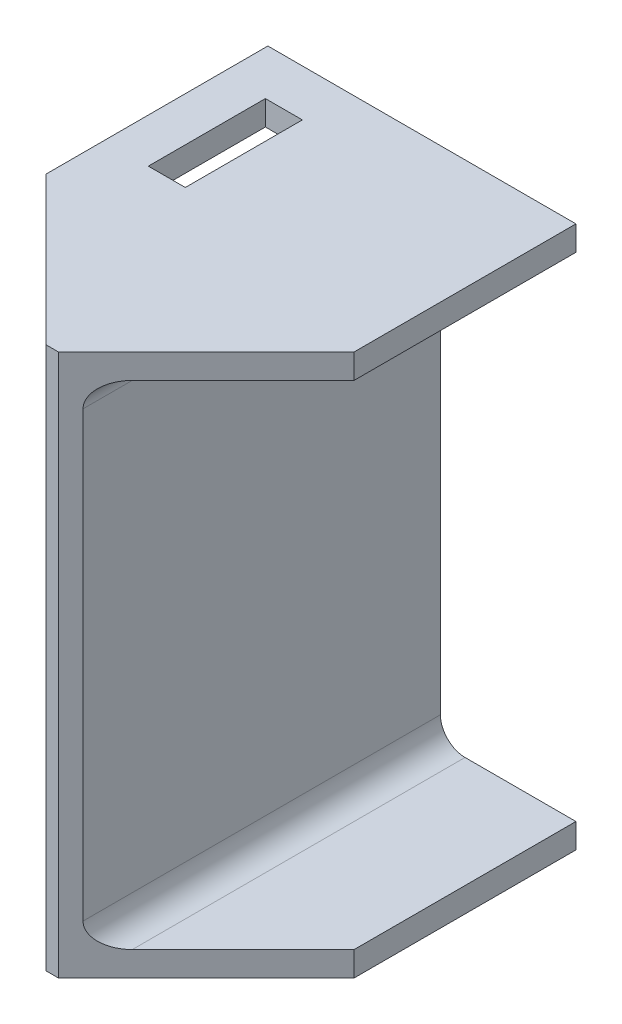
ISO-10303-21;
HEADER;
FILE_DESCRIPTION(('STEP AP214'),'2;1');
FILE_NAME('part.step','',(''),(''),'','','');
FILE_SCHEMA(('AUTOMOTIVE_DESIGN { 1 0 10303 214 1 1 1 1 }'));
ENDSEC;
DATA;
#1=APPLICATION_CONTEXT('core data for automotive mechanical design processes');
#2=APPLICATION_PROTOCOL_DEFINITION('international standard','automotive_design',2000,#1);
#3=PRODUCT_CONTEXT('',#1,'mechanical');
#4=PRODUCT('Part','Part','',(#3));
#5=PRODUCT_RELATED_PRODUCT_CATEGORY('part','',(#4));
#6=PRODUCT_DEFINITION_FORMATION('','',#4);
#7=PRODUCT_DEFINITION_CONTEXT('part definition',#1,'design');
#8=PRODUCT_DEFINITION('design','',#6,#7);
#9=PRODUCT_DEFINITION_SHAPE('','',#8);
#10=(LENGTH_UNIT() NAMED_UNIT(*) SI_UNIT(.MILLI.,.METRE.));
#11=(NAMED_UNIT(*) PLANE_ANGLE_UNIT() SI_UNIT($,.RADIAN.));
#12=(NAMED_UNIT(*) SI_UNIT($,.STERADIAN.) SOLID_ANGLE_UNIT());
#13=UNCERTAINTY_MEASURE_WITH_UNIT(LENGTH_MEASURE(1.E-05),#10,'distance_accuracy_value','');
#14=(GEOMETRIC_REPRESENTATION_CONTEXT(3) GLOBAL_UNCERTAINTY_ASSIGNED_CONTEXT((#13)) GLOBAL_UNIT_ASSIGNED_CONTEXT((#10,
#11,#12)) REPRESENTATION_CONTEXT('',''));
#15=CARTESIAN_POINT('',(0.,0.,0.));
#16=DIRECTION('',(0.,0.,1.));
#17=DIRECTION('',(1.,0.,0.));
#18=AXIS2_PLACEMENT_3D('',#15,#16,#17);
#19=CARTESIAN_POINT('',(-7.13864306784661,36.9262536873156,30.));
#20=DIRECTION('',(1.,0.,0.));
#21=DIRECTION('',(0.,0.,-1.));
#22=AXIS2_PLACEMENT_3D('',#19,#20,#21);
#23=PLANE('',#22);
#24=DIRECTION('',(0.,0.,-1.));
#25=VECTOR('',#24,1.);
#26=CARTESIAN_POINT('',(-7.13864306784661,34.9262536873156,30.));
#27=LINE('',#26,#25);
#28=CARTESIAN_POINT('',(-7.13864306784661,34.9262536873156,18.));
#29=VERTEX_POINT('',#28);
#30=CARTESIAN_POINT('',(-7.13864306784661,34.9262536873156,0.));
#31=VERTEX_POINT('',#30);
#32=EDGE_CURVE('E274',#29,#31,#27,.T.);
#33=ORIENTED_EDGE('',*,*,#32,.F.);
#34=DIRECTION('',(0.,1.,0.));
#35=VECTOR('',#34,1.);
#36=CARTESIAN_POINT('',(-7.13864306784661,36.9262536873156,18.));
#37=LINE('',#36,#35);
#38=CARTESIAN_POINT('',(-7.13864306784661,36.9262536873156,18.));
#39=VERTEX_POINT('',#38);
#40=EDGE_CURVE('E296',#29,#39,#37,.T.);
#41=ORIENTED_EDGE('',*,*,#40,.T.);
#42=DIRECTION('',(0.,0.,-1.));
#43=VECTOR('',#42,1.);
#44=CARTESIAN_POINT('',(-7.13864306784661,36.9262536873156,30.));
#45=LINE('',#44,#43);
#46=CARTESIAN_POINT('',(-7.13864306784661,36.9262536873156,0.));
#47=VERTEX_POINT('',#46);
#48=EDGE_CURVE('E226',#39,#47,#45,.T.);
#49=ORIENTED_EDGE('',*,*,#48,.T.);
#50=DIRECTION('',(0.,-1.,0.));
#51=VECTOR('',#50,1.);
#52=CARTESIAN_POINT('',(-7.13864306784661,36.9262536873156,0.));
#53=LINE('',#52,#51);
#54=EDGE_CURVE('E218',#47,#31,#53,.T.);
#55=ORIENTED_EDGE('',*,*,#54,.T.);
#56=EDGE_LOOP('',(#33,#41,#49,#55));
#57=FACE_BOUND('',#56,.T.);
#58=ADVANCED_FACE('F33',(#57),#23,.F.);
#59=CARTESIAN_POINT('',(-7.13864306784661,34.9262536873156,30.));
#60=DIRECTION('',(0.,1.,0.));
#61=DIRECTION('',(0.,0.,1.));
#62=AXIS2_PLACEMENT_3D('',#59,#60,#61);
#63=PLANE('',#62);
#64=DIRECTION('',(1.,0.,0.));
#65=VECTOR('',#64,1.);
#66=CARTESIAN_POINT('',(-7.13864306784661,34.9262536873156,13.2945058523077));
#67=LINE('',#66,#65);
#68=CARTESIAN_POINT('',(-3.54545344224277,34.9262536873156,13.2945058523077));
#69=VERTEX_POINT('',#68);
#70=CARTESIAN_POINT('',(-0.545453442242774,34.9262536873156,13.2945058523077));
#71=VERTEX_POINT('',#70);
#72=EDGE_CURVE('E212',#69,#71,#67,.T.);
#73=ORIENTED_EDGE('',*,*,#72,.T.);
#74=DIRECTION('',(0.,0.,-1.));
#75=VECTOR('',#74,1.);
#76=CARTESIAN_POINT('',(-0.545453442242774,34.9262536873156,30.));
#77=LINE('',#76,#75);
#78=CARTESIAN_POINT('',(-0.545453442242774,34.9262536873156,3.79450585230774));
#79=VERTEX_POINT('',#78);
#80=EDGE_CURVE('E215',#71,#79,#77,.T.);
#81=ORIENTED_EDGE('',*,*,#80,.T.);
#82=DIRECTION('',(-1.,0.,0.));
#83=VECTOR('',#82,1.);
#84=CARTESIAN_POINT('',(-7.13864306784661,34.9262536873156,3.79450585230774));
#85=LINE('',#84,#83);
#86=CARTESIAN_POINT('',(-3.54545344224277,34.9262536873156,3.79450585230773));
#87=VERTEX_POINT('',#86);
#88=EDGE_CURVE('E207',#79,#87,#85,.T.);
#89=ORIENTED_EDGE('',*,*,#88,.T.);
#90=DIRECTION('',(0.,0.,1.));
#91=VECTOR('',#90,1.);
#92=CARTESIAN_POINT('',(-3.54545344224277,34.9262536873156,30.));
#93=LINE('',#92,#91);
#94=EDGE_CURVE('E187',#87,#69,#93,.T.);
#95=ORIENTED_EDGE('',*,*,#94,.T.);
#96=EDGE_LOOP('',(#73,#81,#89,#95));
#97=FACE_BOUND('',#96,.T.);
#98=DIRECTION('',(1.,0.,0.));
#99=VECTOR('',#98,1.);
#100=CARTESIAN_POINT('',(-7.13864306784661,34.9262536873156,0.));
#101=LINE('',#100,#99);
#102=CARTESIAN_POINT('',(1.86135693215339,34.9262536873156,0.));
#103=VERTEX_POINT('',#102);
#104=EDGE_CURVE('E229',#31,#103,#101,.T.);
#105=ORIENTED_EDGE('',*,*,#104,.T.);
#106=DIRECTION('',(0.,0.,-1.));
#107=VECTOR('',#106,1.);
#108=CARTESIAN_POINT('',(1.86135693215339,34.9262536873156,29.));
#109=LINE('',#108,#107);
#110=CARTESIAN_POINT('',(1.86135693215339,34.9262536873156,27.));
#111=VERTEX_POINT('',#110);
#112=EDGE_CURVE('E327',#103,#111,#109,.F.);
#113=ORIENTED_EDGE('',*,*,#112,.T.);
#114=DIRECTION('',(-0.707106781186546,0.,-0.707106781186549));
#115=VECTOR('',#114,1.);
#116=CARTESIAN_POINT('',(4.86135693215339,34.9262536873156,30.));
#117=LINE('',#116,#115);
#118=EDGE_CURVE('E294',#111,#29,#117,.T.);
#119=ORIENTED_EDGE('',*,*,#118,.T.);
#120=ORIENTED_EDGE('',*,*,#32,.T.);
#121=EDGE_LOOP('',(#105,#113,#119,#120));
#122=FACE_BOUND('',#121,.T.);
#123=ADVANCED_FACE('F426',(#97,#122),#63,.F.);
#124=CARTESIAN_POINT('',(3.86135693215339,34.9262536873156,30.));
#125=DIRECTION('',(1.,0.,0.));
#126=DIRECTION('',(0.,1.,0.));
#127=AXIS2_PLACEMENT_3D('',#124,#125,#126);
#128=PLANE('',#127);
#129=DIRECTION('',(0.,1.,0.));
#130=VECTOR('',#129,1.);
#131=CARTESIAN_POINT('',(3.86135693215339,0.,29.));
#132=LINE('',#131,#130);
#133=CARTESIAN_POINT('',(3.86135693215339,-3.07374631268437,29.));
#134=VERTEX_POINT('',#133);
#135=CARTESIAN_POINT('',(3.86135693215339,32.9262536873156,29.));
#136=VERTEX_POINT('',#135);
#137=EDGE_CURVE('E291',#134,#136,#132,.T.);
#138=ORIENTED_EDGE('',*,*,#137,.T.);
#139=DIRECTION('',(0.,0.,-1.));
#140=VECTOR('',#139,1.);
#141=CARTESIAN_POINT('',(3.86135693215339,32.9262536873156,0.));
#142=LINE('',#141,#140);
#143=CARTESIAN_POINT('',(3.86135693215339,32.9262536873156,0.));
#144=VERTEX_POINT('',#143);
#145=EDGE_CURVE('E324',#136,#144,#142,.T.);
#146=ORIENTED_EDGE('',*,*,#145,.T.);
#147=DIRECTION('',(0.,-1.,0.));
#148=VECTOR('',#147,1.);
#149=CARTESIAN_POINT('',(3.86135693215339,34.9262536873156,0.));
#150=LINE('',#149,#148);
#151=CARTESIAN_POINT('',(3.86135693215339,-3.07374631268437,0.));
#152=VERTEX_POINT('',#151);
#153=EDGE_CURVE('E232',#144,#152,#150,.T.);
#154=ORIENTED_EDGE('',*,*,#153,.T.);
#155=DIRECTION('',(0.,0.,-1.));
#156=VECTOR('',#155,1.);
#157=CARTESIAN_POINT('',(3.86135693215339,-3.07374631268437,29.));
#158=LINE('',#157,#156);
#159=EDGE_CURVE('E322',#152,#134,#158,.F.);
#160=ORIENTED_EDGE('',*,*,#159,.T.);
#161=EDGE_LOOP('',(#138,#146,#154,#160));
#162=FACE_BOUND('',#161,.T.);
#163=ADVANCED_FACE('F419',(#162),#128,.F.);
#164=CARTESIAN_POINT('',(-7.13864306784661,-5.07374631268437,30.));
#165=DIRECTION('',(0.,-1.,0.));
#166=DIRECTION('',(1.,0.,0.));
#167=AXIS2_PLACEMENT_3D('',#164,#165,#166);
#168=PLANE('',#167);
#169=DIRECTION('',(0.707106781186546,0.,0.707106781186549));
#170=VECTOR('',#169,1.);
#171=CARTESIAN_POINT('',(4.86135693215339,-5.07374631268437,30.));
#172=LINE('',#171,#170);
#173=CARTESIAN_POINT('',(-7.13864306784661,-5.07374631268437,18.));
#174=VERTEX_POINT('',#173);
#175=CARTESIAN_POINT('',(1.86135693215339,-5.07374631268437,27.));
#176=VERTEX_POINT('',#175);
#177=EDGE_CURVE('E288',#174,#176,#172,.T.);
#178=ORIENTED_EDGE('',*,*,#177,.T.);
#179=DIRECTION('',(0.,0.,-1.));
#180=VECTOR('',#179,1.);
#181=CARTESIAN_POINT('',(1.86135693215339,-5.07374631268437,0.));
#182=LINE('',#181,#180);
#183=CARTESIAN_POINT('',(1.86135693215339,-5.07374631268437,0.));
#184=VERTEX_POINT('',#183);
#185=EDGE_CURVE('E329',#176,#184,#182,.T.);
#186=ORIENTED_EDGE('',*,*,#185,.T.);
#187=DIRECTION('',(-1.,0.,0.));
#188=VECTOR('',#187,1.);
#189=CARTESIAN_POINT('',(-7.13864306784661,-5.07374631268437,0.));
#190=LINE('',#189,#188);
#191=CARTESIAN_POINT('',(-7.13864306784661,-5.07374631268437,0.));
#192=VERTEX_POINT('',#191);
#193=EDGE_CURVE('E235',#184,#192,#190,.T.);
#194=ORIENTED_EDGE('',*,*,#193,.T.);
#195=DIRECTION('',(0.,0.,-1.));
#196=VECTOR('',#195,1.);
#197=CARTESIAN_POINT('',(-7.13864306784661,-5.07374631268437,30.));
#198=LINE('',#197,#196);
#199=EDGE_CURVE('E271',#174,#192,#198,.T.);
#200=ORIENTED_EDGE('',*,*,#199,.F.);
#201=EDGE_LOOP('',(#178,#186,#194,#200));
#202=FACE_BOUND('',#201,.T.);
#203=ADVANCED_FACE('F410',(#202),#168,.F.);
#204=CARTESIAN_POINT('',(-7.13864306784661,-5.07374631268437,30.));
#205=DIRECTION('',(1.,0.,0.));
#206=DIRECTION('',(0.,1.,0.));
#207=AXIS2_PLACEMENT_3D('',#204,#205,#206);
#208=PLANE('',#207);
#209=DIRECTION('',(0.,0.,-1.));
#210=VECTOR('',#209,1.);
#211=CARTESIAN_POINT('',(-7.13864306784661,-7.07374631268437,30.));
#212=LINE('',#211,#210);
#213=CARTESIAN_POINT('',(-7.13864306784661,-7.07374631268437,18.));
#214=VERTEX_POINT('',#213);
#215=CARTESIAN_POINT('',(-7.13864306784661,-7.07374631268437,0.));
#216=VERTEX_POINT('',#215);
#217=EDGE_CURVE('E269',#214,#216,#212,.T.);
#218=ORIENTED_EDGE('',*,*,#217,.F.);
#219=DIRECTION('',(0.,1.,0.));
#220=VECTOR('',#219,1.);
#221=CARTESIAN_POINT('',(-7.13864306784661,0.,18.));
#222=LINE('',#221,#220);
#223=EDGE_CURVE('E286',#214,#174,#222,.T.);
#224=ORIENTED_EDGE('',*,*,#223,.T.);
#225=ORIENTED_EDGE('',*,*,#199,.T.);
#226=DIRECTION('',(0.,-1.,0.));
#227=VECTOR('',#226,1.);
#228=CARTESIAN_POINT('',(-7.13864306784661,-5.07374631268437,0.));
#229=LINE('',#228,#227);
#230=EDGE_CURVE('E237',#192,#216,#229,.T.);
#231=ORIENTED_EDGE('',*,*,#230,.T.);
#232=EDGE_LOOP('',(#218,#224,#225,#231));
#233=FACE_BOUND('',#232,.T.);
#234=ADVANCED_FACE('F406',(#233),#208,.F.);
#235=CARTESIAN_POINT('',(-7.13864306784661,-7.07374631268437,30.));
#236=DIRECTION('',(0.,1.,0.));
#237=DIRECTION('',(-1.,0.,0.));
#238=AXIS2_PLACEMENT_3D('',#235,#236,#237);
#239=PLANE('',#238);
#240=DIRECTION('',(1.,0.,0.));
#241=VECTOR('',#240,1.);
#242=CARTESIAN_POINT('',(-7.13864306784661,-7.07374631268437,30.));
#243=LINE('',#242,#241);
#244=CARTESIAN_POINT('',(4.86135693215339,-7.07374631268437,30.));
#245=VERTEX_POINT('',#244);
#246=CARTESIAN_POINT('',(5.86135693215339,-7.07374631268437,30.));
#247=VERTEX_POINT('',#246);
#248=EDGE_CURVE('E219',#245,#247,#243,.T.);
#249=ORIENTED_EDGE('',*,*,#248,.F.);
#250=DIRECTION('',(-0.707106781186546,0.,-0.707106781186549));
#251=VECTOR('',#250,1.);
#252=CARTESIAN_POINT('',(4.86135693215339,-7.07374631268437,30.));
#253=LINE('',#252,#251);
#254=EDGE_CURVE('E284',#245,#214,#253,.T.);
#255=ORIENTED_EDGE('',*,*,#254,.T.);
#256=ORIENTED_EDGE('',*,*,#217,.T.);
#257=DIRECTION('',(1.,0.,0.));
#258=VECTOR('',#257,1.);
#259=CARTESIAN_POINT('',(-7.13864306784661,-7.07374631268437,0.));
#260=LINE('',#259,#258);
#261=CARTESIAN_POINT('',(17.8613569321534,-7.07374631268437,0.));
#262=VERTEX_POINT('',#261);
#263=EDGE_CURVE('E240',#216,#262,#260,.T.);
#264=ORIENTED_EDGE('',*,*,#263,.T.);
#265=DIRECTION('',(0.,0.,-1.));
#266=VECTOR('',#265,1.);
#267=CARTESIAN_POINT('',(17.8613569321534,-7.07374631268437,30.));
#268=LINE('',#267,#266);
#269=CARTESIAN_POINT('',(17.8613569321534,-7.07374631268437,18.));
#270=VERTEX_POINT('',#269);
#271=EDGE_CURVE('E267',#270,#262,#268,.T.);
#272=ORIENTED_EDGE('',*,*,#271,.F.);
#273=DIRECTION('',(-0.707106781186546,0.,0.707106781186549));
#274=VECTOR('',#273,1.);
#275=CARTESIAN_POINT('',(5.86135693215339,-7.07374631268437,30.));
#276=LINE('',#275,#274);
#277=EDGE_CURVE('E282',#270,#247,#276,.T.);
#278=ORIENTED_EDGE('',*,*,#277,.T.);
#279=EDGE_LOOP('',(#249,#255,#256,#264,#272,#278));
#280=FACE_BOUND('',#279,.T.);
#281=ADVANCED_FACE('F397',(#280),#239,.F.);
#282=CARTESIAN_POINT('',(17.8613569321534,-5.07374631268437,30.));
#283=DIRECTION('',(-1.,0.,0.));
#284=DIRECTION('',(0.,0.,1.));
#285=AXIS2_PLACEMENT_3D('',#282,#283,#284);
#286=PLANE('',#285);
#287=DIRECTION('',(0.,0.,-1.));
#288=VECTOR('',#287,1.);
#289=CARTESIAN_POINT('',(17.8613569321534,-5.07374631268437,30.));
#290=LINE('',#289,#288);
#291=CARTESIAN_POINT('',(17.8613569321534,-5.07374631268437,18.));
#292=VERTEX_POINT('',#291);
#293=CARTESIAN_POINT('',(17.8613569321534,-5.07374631268437,0.));
#294=VERTEX_POINT('',#293);
#295=EDGE_CURVE('E265',#292,#294,#290,.T.);
#296=ORIENTED_EDGE('',*,*,#295,.F.);
#297=DIRECTION('',(0.,-1.,0.));
#298=VECTOR('',#297,1.);
#299=CARTESIAN_POINT('',(17.8613569321534,0.,18.));
#300=LINE('',#299,#298);
#301=EDGE_CURVE('E312',#292,#270,#300,.T.);
#302=ORIENTED_EDGE('',*,*,#301,.T.);
#303=ORIENTED_EDGE('',*,*,#271,.T.);
#304=DIRECTION('',(0.,1.,0.));
#305=VECTOR('',#304,1.);
#306=CARTESIAN_POINT('',(17.8613569321534,-5.07374631268437,0.));
#307=LINE('',#306,#305);
#308=EDGE_CURVE('E243',#262,#294,#307,.T.);
#309=ORIENTED_EDGE('',*,*,#308,.T.);
#310=EDGE_LOOP('',(#296,#302,#303,#309));
#311=FACE_BOUND('',#310,.T.);
#312=ADVANCED_FACE('F401',(#311),#286,.F.);
#313=CARTESIAN_POINT('',(6.86135693215339,-5.07374631268437,30.));
#314=DIRECTION('',(0.,-1.,0.));
#315=DIRECTION('',(0.,0.,-1.));
#316=AXIS2_PLACEMENT_3D('',#313,#314,#315);
#317=PLANE('',#316);
#318=DIRECTION('',(-1.,0.,0.));
#319=VECTOR('',#318,1.);
#320=CARTESIAN_POINT('',(6.86135693215339,-5.07374631268437,0.));
#321=LINE('',#320,#319);
#322=CARTESIAN_POINT('',(8.86135693215339,-5.07374631268437,0.));
#323=VERTEX_POINT('',#322);
#324=EDGE_CURVE('E246',#294,#323,#321,.T.);
#325=ORIENTED_EDGE('',*,*,#324,.T.);
#326=DIRECTION('',(0.,0.,-1.));
#327=VECTOR('',#326,1.);
#328=CARTESIAN_POINT('',(8.86135693215339,-5.07374631268437,29.));
#329=LINE('',#328,#327);
#330=CARTESIAN_POINT('',(8.86135693215339,-5.07374631268437,27.));
#331=VERTEX_POINT('',#330);
#332=EDGE_CURVE('E332',#323,#331,#329,.F.);
#333=ORIENTED_EDGE('',*,*,#332,.T.);
#334=DIRECTION('',(0.707106781186546,0.,-0.707106781186549));
#335=VECTOR('',#334,1.);
#336=CARTESIAN_POINT('',(5.86135693215339,-5.07374631268437,30.));
#337=LINE('',#336,#335);
#338=EDGE_CURVE('E310',#331,#292,#337,.T.);
#339=ORIENTED_EDGE('',*,*,#338,.T.);
#340=ORIENTED_EDGE('',*,*,#295,.T.);
#341=EDGE_LOOP('',(#325,#333,#339,#340));
#342=FACE_BOUND('',#341,.T.);
#343=ADVANCED_FACE('F355',(#342),#317,.F.);
#344=CARTESIAN_POINT('',(6.86135693215339,34.9262536873156,30.));
#345=DIRECTION('',(-1.,0.,0.));
#346=DIRECTION('',(0.,0.,1.));
#347=AXIS2_PLACEMENT_3D('',#344,#345,#346);
#348=PLANE('',#347);
#349=DIRECTION('',(0.,1.,0.));
#350=VECTOR('',#349,1.);
#351=CARTESIAN_POINT('',(6.86135693215339,34.9262536873156,0.));
#352=LINE('',#351,#350);
#353=CARTESIAN_POINT('',(6.86135693215339,-3.07374631268437,0.));
#354=VERTEX_POINT('',#353);
#355=CARTESIAN_POINT('',(6.86135693215339,32.9262536873156,0.));
#356=VERTEX_POINT('',#355);
#357=EDGE_CURVE('E249',#354,#356,#352,.T.);
#358=ORIENTED_EDGE('',*,*,#357,.T.);
#359=DIRECTION('',(0.,0.,-1.));
#360=VECTOR('',#359,1.);
#361=CARTESIAN_POINT('',(6.86135693215339,32.9262536873156,29.));
#362=LINE('',#361,#360);
#363=CARTESIAN_POINT('',(6.86135693215339,32.9262536873156,29.));
#364=VERTEX_POINT('',#363);
#365=EDGE_CURVE('E320',#356,#364,#362,.F.);
#366=ORIENTED_EDGE('',*,*,#365,.T.);
#367=DIRECTION('',(0.,-1.,0.));
#368=VECTOR('',#367,1.);
#369=CARTESIAN_POINT('',(6.86135693215339,0.,29.));
#370=LINE('',#369,#368);
#371=CARTESIAN_POINT('',(6.86135693215339,-3.07374631268437,29.));
#372=VERTEX_POINT('',#371);
#373=EDGE_CURVE('E307',#364,#372,#370,.T.);
#374=ORIENTED_EDGE('',*,*,#373,.T.);
#375=DIRECTION('',(0.,0.,-1.));
#376=VECTOR('',#375,1.);
#377=CARTESIAN_POINT('',(6.86135693215339,-3.07374631268437,0.));
#378=LINE('',#377,#376);
#379=EDGE_CURVE('E317',#372,#354,#378,.T.);
#380=ORIENTED_EDGE('',*,*,#379,.T.);
#381=EDGE_LOOP('',(#358,#366,#374,#380));
#382=FACE_BOUND('',#381,.T.);
#383=ADVANCED_FACE('F366',(#382),#348,.F.);
#384=CARTESIAN_POINT('',(6.86135693215339,34.9262536873156,30.));
#385=DIRECTION('',(0.,1.,0.));
#386=DIRECTION('',(-1.,0.,0.));
#387=AXIS2_PLACEMENT_3D('',#384,#385,#386);
#388=PLANE('',#387);
#389=DIRECTION('',(-0.707106781186546,0.,0.707106781186549));
#390=VECTOR('',#389,1.);
#391=CARTESIAN_POINT('',(5.86135693215341,34.9262536873156,30.));
#392=LINE('',#391,#390);
#393=CARTESIAN_POINT('',(17.8613569321534,34.9262536873156,18.));
#394=VERTEX_POINT('',#393);
#395=CARTESIAN_POINT('',(8.8613569321534,34.9262536873156,27.));
#396=VERTEX_POINT('',#395);
#397=EDGE_CURVE('E304',#394,#396,#392,.T.);
#398=ORIENTED_EDGE('',*,*,#397,.T.);
#399=DIRECTION('',(0.,0.,-1.));
#400=VECTOR('',#399,1.);
#401=CARTESIAN_POINT('',(8.86135693215339,34.9262536873156,0.));
#402=LINE('',#401,#400);
#403=CARTESIAN_POINT('',(8.86135693215339,34.9262536873156,0.));
#404=VERTEX_POINT('',#403);
#405=EDGE_CURVE('E314',#396,#404,#402,.T.);
#406=ORIENTED_EDGE('',*,*,#405,.T.);
#407=DIRECTION('',(1.,0.,0.));
#408=VECTOR('',#407,1.);
#409=CARTESIAN_POINT('',(6.86135693215339,34.9262536873156,0.));
#410=LINE('',#409,#408);
#411=CARTESIAN_POINT('',(17.8613569321534,34.9262536873156,0.));
#412=VERTEX_POINT('',#411);
#413=EDGE_CURVE('E252',#404,#412,#410,.T.);
#414=ORIENTED_EDGE('',*,*,#413,.T.);
#415=DIRECTION('',(0.,0.,-1.));
#416=VECTOR('',#415,1.);
#417=CARTESIAN_POINT('',(17.8613569321534,34.9262536873156,30.));
#418=LINE('',#417,#416);
#419=EDGE_CURVE('E262',#394,#412,#418,.T.);
#420=ORIENTED_EDGE('',*,*,#419,.F.);
#421=EDGE_LOOP('',(#398,#406,#414,#420));
#422=FACE_BOUND('',#421,.T.);
#423=ADVANCED_FACE('F374',(#422),#388,.F.);
#424=CARTESIAN_POINT('',(17.8613569321534,36.9262536873156,30.));
#425=DIRECTION('',(-1.,0.,0.));
#426=DIRECTION('',(0.,0.,1.));
#427=AXIS2_PLACEMENT_3D('',#424,#425,#426);
#428=PLANE('',#427);
#429=DIRECTION('',(0.,0.,-1.));
#430=VECTOR('',#429,1.);
#431=CARTESIAN_POINT('',(17.8613569321534,36.9262536873156,30.));
#432=LINE('',#431,#430);
#433=CARTESIAN_POINT('',(17.8613569321534,36.9262536873156,18.));
#434=VERTEX_POINT('',#433);
#435=CARTESIAN_POINT('',(17.8613569321534,36.9262536873156,0.));
#436=VERTEX_POINT('',#435);
#437=EDGE_CURVE('E260',#434,#436,#432,.T.);
#438=ORIENTED_EDGE('',*,*,#437,.F.);
#439=DIRECTION('',(0.,-1.,0.));
#440=VECTOR('',#439,1.);
#441=CARTESIAN_POINT('',(17.8613569321534,34.9262536873156,18.));
#442=LINE('',#441,#440);
#443=EDGE_CURVE('E302',#434,#394,#442,.T.);
#444=ORIENTED_EDGE('',*,*,#443,.T.);
#445=ORIENTED_EDGE('',*,*,#419,.T.);
#446=DIRECTION('',(0.,1.,0.));
#447=VECTOR('',#446,1.);
#448=CARTESIAN_POINT('',(17.8613569321534,36.9262536873156,0.));
#449=LINE('',#448,#447);
#450=EDGE_CURVE('E254',#412,#436,#449,.T.);
#451=ORIENTED_EDGE('',*,*,#450,.T.);
#452=EDGE_LOOP('',(#438,#444,#445,#451));
#453=FACE_BOUND('',#452,.T.);
#454=ADVANCED_FACE('F379',(#453),#428,.F.);
#455=CARTESIAN_POINT('',(-7.13864306784661,36.9262536873156,30.));
#456=DIRECTION('',(0.,-1.,0.));
#457=DIRECTION('',(0.,0.,-1.));
#458=AXIS2_PLACEMENT_3D('',#455,#456,#457);
#459=PLANE('',#458);
#460=DIRECTION('',(-1.,0.,0.));
#461=VECTOR('',#460,1.);
#462=CARTESIAN_POINT('',(-0.545453442242774,36.9262536873156,3.79450585230774));
#463=LINE('',#462,#461);
#464=CARTESIAN_POINT('',(-0.545453442242774,36.9262536873156,3.79450585230773));
#465=VERTEX_POINT('',#464);
#466=CARTESIAN_POINT('',(-3.54545344224277,36.9262536873156,3.79450585230774));
#467=VERTEX_POINT('',#466);
#468=EDGE_CURVE('E193',#465,#467,#463,.T.);
#469=ORIENTED_EDGE('',*,*,#468,.F.);
#470=DIRECTION('',(0.,0.,-1.));
#471=VECTOR('',#470,1.);
#472=CARTESIAN_POINT('',(-0.545453442242774,36.9262536873156,13.2945058523077));
#473=LINE('',#472,#471);
#474=CARTESIAN_POINT('',(-0.545453442242774,36.9262536873156,13.2945058523077));
#475=VERTEX_POINT('',#474);
#476=EDGE_CURVE('E56',#475,#465,#473,.T.);
#477=ORIENTED_EDGE('',*,*,#476,.F.);
#478=DIRECTION('',(1.,0.,0.));
#479=VECTOR('',#478,1.);
#480=CARTESIAN_POINT('',(-0.545453442242774,36.9262536873156,13.2945058523077));
#481=LINE('',#480,#479);
#482=CARTESIAN_POINT('',(-3.54545344224277,36.9262536873156,13.2945058523077));
#483=VERTEX_POINT('',#482);
#484=EDGE_CURVE('E200',#483,#475,#481,.T.);
#485=ORIENTED_EDGE('',*,*,#484,.F.);
#486=DIRECTION('',(0.,0.,1.));
#487=VECTOR('',#486,1.);
#488=CARTESIAN_POINT('',(-3.54545344224277,36.9262536873156,13.2945058523077));
#489=LINE('',#488,#487);
#490=EDGE_CURVE('E184',#467,#483,#489,.T.);
#491=ORIENTED_EDGE('',*,*,#490,.F.);
#492=EDGE_LOOP('',(#469,#477,#485,#491));
#493=FACE_BOUND('',#492,.T.);
#494=ORIENTED_EDGE('',*,*,#48,.F.);
#495=DIRECTION('',(0.707106781186546,0.,0.707106781186549));
#496=VECTOR('',#495,1.);
#497=CARTESIAN_POINT('',(4.86135693215339,36.9262536873156,30.));
#498=LINE('',#497,#496);
#499=CARTESIAN_POINT('',(4.86135693215339,36.9262536873156,30.));
#500=VERTEX_POINT('',#499);
#501=EDGE_CURVE('E300',#39,#500,#498,.T.);
#502=ORIENTED_EDGE('',*,*,#501,.T.);
#503=DIRECTION('',(-1.,0.,0.));
#504=VECTOR('',#503,1.);
#505=CARTESIAN_POINT('',(-7.13864306784661,36.9262536873156,30.));
#506=LINE('',#505,#504);
#507=CARTESIAN_POINT('',(5.86135693215339,36.9262536873156,30.));
#508=VERTEX_POINT('',#507);
#509=EDGE_CURVE('E222',#508,#500,#506,.T.);
#510=ORIENTED_EDGE('',*,*,#509,.F.);
#511=DIRECTION('',(0.707106781186546,0.,-0.707106781186549));
#512=VECTOR('',#511,1.);
#513=CARTESIAN_POINT('',(5.86135693215339,36.9262536873156,30.));
#514=LINE('',#513,#512);
#515=EDGE_CURVE('E298',#508,#434,#514,.T.);
#516=ORIENTED_EDGE('',*,*,#515,.T.);
#517=ORIENTED_EDGE('',*,*,#437,.T.);
#518=DIRECTION('',(-1.,0.,0.));
#519=VECTOR('',#518,1.);
#520=CARTESIAN_POINT('',(-7.13864306784661,36.9262536873156,0.));
#521=LINE('',#520,#519);
#522=EDGE_CURVE('E223',#436,#47,#521,.T.);
#523=ORIENTED_EDGE('',*,*,#522,.T.);
#524=EDGE_LOOP('',(#494,#502,#510,#516,#517,#523));
#525=FACE_BOUND('',#524,.T.);
#526=ADVANCED_FACE('F197',(#493,#525),#459,.F.);
#527=CARTESIAN_POINT('',(0.,0.,30.));
#528=DIRECTION('',(0.,0.,1.));
#529=DIRECTION('',(1.,0.,0.));
#530=AXIS2_PLACEMENT_3D('',#527,#528,#529);
#531=PLANE('',#530);
#532=ORIENTED_EDGE('',*,*,#509,.T.);
#533=DIRECTION('',(0.,-1.,0.));
#534=VECTOR('',#533,1.);
#535=CARTESIAN_POINT('',(4.86135693215339,34.9262536873156,30.));
#536=LINE('',#535,#534);
#537=EDGE_CURVE('E279',#500,#245,#536,.T.);
#538=ORIENTED_EDGE('',*,*,#537,.T.);
#539=ORIENTED_EDGE('',*,*,#248,.T.);
#540=DIRECTION('',(0.,1.,0.));
#541=VECTOR('',#540,1.);
#542=CARTESIAN_POINT('',(5.86135693215339,36.9262536873156,30.));
#543=LINE('',#542,#541);
#544=EDGE_CURVE('E276',#247,#508,#543,.T.);
#545=ORIENTED_EDGE('',*,*,#544,.T.);
#546=EDGE_LOOP('',(#532,#538,#539,#545));
#547=FACE_BOUND('',#546,.T.);
#548=ADVANCED_FACE('F388',(#547),#531,.T.);
#549=CARTESIAN_POINT('',(0.,0.,0.));
#550=DIRECTION('',(0.,0.,1.));
#551=DIRECTION('',(1.,0.,0.));
#552=AXIS2_PLACEMENT_3D('',#549,#550,#551);
#553=PLANE('',#552);
#554=ORIENTED_EDGE('',*,*,#54,.F.);
#555=ORIENTED_EDGE('',*,*,#522,.F.);
#556=ORIENTED_EDGE('',*,*,#450,.F.);
#557=ORIENTED_EDGE('',*,*,#413,.F.);
#558=CARTESIAN_POINT('',(8.86135693215339,32.9262536873156,0.));
#559=DIRECTION('',(0.,0.,1.));
#560=DIRECTION('',(1.,0.,0.));
#561=AXIS2_PLACEMENT_3D('',#558,#559,#560);
#562=CIRCLE('',#561,2.);
#563=EDGE_CURVE('E334',#404,#356,#562,.T.);
#564=ORIENTED_EDGE('',*,*,#563,.T.);
#565=ORIENTED_EDGE('',*,*,#357,.F.);
#566=CARTESIAN_POINT('',(8.86135693215339,-3.07374631268437,0.));
#567=DIRECTION('',(0.,0.,1.));
#568=DIRECTION('',(1.,0.,0.));
#569=AXIS2_PLACEMENT_3D('',#566,#567,#568);
#570=CIRCLE('',#569,2.);
#571=EDGE_CURVE('E41',#354,#323,#570,.T.);
#572=ORIENTED_EDGE('',*,*,#571,.T.);
#573=ORIENTED_EDGE('',*,*,#324,.F.);
#574=ORIENTED_EDGE('',*,*,#308,.F.);
#575=ORIENTED_EDGE('',*,*,#263,.F.);
#576=ORIENTED_EDGE('',*,*,#230,.F.);
#577=ORIENTED_EDGE('',*,*,#193,.F.);
#578=CARTESIAN_POINT('',(1.86135693215339,-3.07374631268437,0.));
#579=DIRECTION('',(0.,0.,1.));
#580=DIRECTION('',(1.,0.,0.));
#581=AXIS2_PLACEMENT_3D('',#578,#579,#580);
#582=CIRCLE('',#581,2.);
#583=EDGE_CURVE('E342',#184,#152,#582,.T.);
#584=ORIENTED_EDGE('',*,*,#583,.T.);
#585=ORIENTED_EDGE('',*,*,#153,.F.);
#586=CARTESIAN_POINT('',(1.86135693215339,32.9262536873156,0.));
#587=DIRECTION('',(0.,0.,1.));
#588=DIRECTION('',(1.,0.,0.));
#589=AXIS2_PLACEMENT_3D('',#586,#587,#588);
#590=CIRCLE('',#589,2.);
#591=EDGE_CURVE('E338',#144,#103,#590,.T.);
#592=ORIENTED_EDGE('',*,*,#591,.T.);
#593=ORIENTED_EDGE('',*,*,#104,.F.);
#594=EDGE_LOOP('',(#554,#555,#556,#557,#564,#565,#572,#573,#574,#575,#576,#577,#584,#585,#592,#593));
#595=FACE_BOUND('',#594,.T.);
#596=ADVANCED_FACE('F349',(#595),#553,.F.);
#597=CARTESIAN_POINT('',(4.86135693215339,0.,30.));
#598=DIRECTION('',(-0.707106781186549,0.,0.707106781186546));
#599=DIRECTION('',(0.,1.,0.));
#600=AXIS2_PLACEMENT_3D('',#597,#598,#599);
#601=PLANE('',#600);
#602=ORIENTED_EDGE('',*,*,#501,.F.);
#603=ORIENTED_EDGE('',*,*,#40,.F.);
#604=ORIENTED_EDGE('',*,*,#118,.F.);
#605=CARTESIAN_POINT('',(1.86135693215339,32.9262536873156,27.));
#606=DIRECTION('',(-0.707106781186549,0.,0.707106781186546));
#607=DIRECTION('',(0.707106781186546,0.,0.707106781186549));
#608=AXIS2_PLACEMENT_3D('',#605,#606,#607);
#609=ELLIPSE('',#608,2.82842712474619,2.);
#610=EDGE_CURVE('E340',#111,#136,#609,.F.);
#611=ORIENTED_EDGE('',*,*,#610,.T.);
#612=ORIENTED_EDGE('',*,*,#137,.F.);
#613=CARTESIAN_POINT('',(1.86135693215339,-3.07374631268437,27.));
#614=DIRECTION('',(-0.707106781186549,0.,0.707106781186546));
#615=DIRECTION('',(0.707106781186546,0.,0.707106781186549));
#616=AXIS2_PLACEMENT_3D('',#613,#614,#615);
#617=ELLIPSE('',#616,2.82842712474619,2.);
#618=EDGE_CURVE('E344',#134,#176,#617,.F.);
#619=ORIENTED_EDGE('',*,*,#618,.T.);
#620=ORIENTED_EDGE('',*,*,#177,.F.);
#621=ORIENTED_EDGE('',*,*,#223,.F.);
#622=ORIENTED_EDGE('',*,*,#254,.F.);
#623=ORIENTED_EDGE('',*,*,#537,.F.);
#624=EDGE_LOOP('',(#602,#603,#604,#611,#612,#619,#620,#621,#622,#623));
#625=FACE_BOUND('',#624,.T.);
#626=ADVANCED_FACE('F393',(#625),#601,.T.);
#627=CARTESIAN_POINT('',(5.86135693215339,0.,30.));
#628=DIRECTION('',(0.707106781186549,0.,0.707106781186546));
#629=DIRECTION('',(0.,-1.,0.));
#630=AXIS2_PLACEMENT_3D('',#627,#628,#629);
#631=PLANE('',#630);
#632=ORIENTED_EDGE('',*,*,#397,.F.);
#633=ORIENTED_EDGE('',*,*,#443,.F.);
#634=ORIENTED_EDGE('',*,*,#515,.F.);
#635=ORIENTED_EDGE('',*,*,#544,.F.);
#636=ORIENTED_EDGE('',*,*,#277,.F.);
#637=ORIENTED_EDGE('',*,*,#301,.F.);
#638=ORIENTED_EDGE('',*,*,#338,.F.);
#639=CARTESIAN_POINT('',(8.86135693215339,-3.07374631268437,27.));
#640=DIRECTION('',(0.707106781186549,0.,0.707106781186546));
#641=DIRECTION('',(-0.707106781186546,0.,0.707106781186549));
#642=AXIS2_PLACEMENT_3D('',#639,#640,#641);
#643=ELLIPSE('',#642,2.82842712474619,2.);
#644=EDGE_CURVE('E11',#331,#372,#643,.F.);
#645=ORIENTED_EDGE('',*,*,#644,.T.);
#646=ORIENTED_EDGE('',*,*,#373,.F.);
#647=CARTESIAN_POINT('',(8.86135693215339,32.9262536873156,27.));
#648=DIRECTION('',(0.707106781186549,0.,0.707106781186546));
#649=DIRECTION('',(-0.707106781186546,0.,0.707106781186549));
#650=AXIS2_PLACEMENT_3D('',#647,#648,#649);
#651=ELLIPSE('',#650,2.82842712474619,2.);
#652=EDGE_CURVE('E336',#364,#396,#651,.F.);
#653=ORIENTED_EDGE('',*,*,#652,.T.);
#654=EDGE_LOOP('',(#632,#633,#634,#635,#636,#637,#638,#645,#646,#653));
#655=FACE_BOUND('',#654,.T.);
#656=ADVANCED_FACE('F362',(#655),#631,.T.);
#657=CARTESIAN_POINT('',(8.86135693215339,32.9262536873156,30.));
#658=DIRECTION('',(0.,0.,1.));
#659=DIRECTION('',(1.,0.,0.));
#660=AXIS2_PLACEMENT_3D('',#657,#658,#659);
#661=CYLINDRICAL_SURFACE('',#660,2.);
#662=ORIENTED_EDGE('',*,*,#652,.F.);
#663=ORIENTED_EDGE('',*,*,#365,.F.);
#664=ORIENTED_EDGE('',*,*,#563,.F.);
#665=ORIENTED_EDGE('',*,*,#405,.F.);
#666=EDGE_LOOP('',(#662,#663,#664,#665));
#667=FACE_BOUND('',#666,.T.);
#668=ADVANCED_FACE('F369',(#667),#661,.F.);
#669=CARTESIAN_POINT('',(1.86135693215339,32.9262536873156,30.));
#670=DIRECTION('',(0.,0.,1.));
#671=DIRECTION('',(1.,0.,0.));
#672=AXIS2_PLACEMENT_3D('',#669,#670,#671);
#673=CYLINDRICAL_SURFACE('',#672,2.);
#674=ORIENTED_EDGE('',*,*,#610,.F.);
#675=ORIENTED_EDGE('',*,*,#112,.F.);
#676=ORIENTED_EDGE('',*,*,#591,.F.);
#677=ORIENTED_EDGE('',*,*,#145,.F.);
#678=EDGE_LOOP('',(#674,#675,#676,#677));
#679=FACE_BOUND('',#678,.T.);
#680=ADVANCED_FACE('F423',(#679),#673,.F.);
#681=CARTESIAN_POINT('',(1.86135693215339,-3.07374631268437,30.));
#682=DIRECTION('',(0.,0.,1.));
#683=DIRECTION('',(1.,0.,0.));
#684=AXIS2_PLACEMENT_3D('',#681,#682,#683);
#685=CYLINDRICAL_SURFACE('',#684,2.);
#686=ORIENTED_EDGE('',*,*,#618,.F.);
#687=ORIENTED_EDGE('',*,*,#159,.F.);
#688=ORIENTED_EDGE('',*,*,#583,.F.);
#689=ORIENTED_EDGE('',*,*,#185,.F.);
#690=EDGE_LOOP('',(#686,#687,#688,#689));
#691=FACE_BOUND('',#690,.T.);
#692=ADVANCED_FACE('F416',(#691),#685,.F.);
#693=CARTESIAN_POINT('',(8.86135693215339,-3.07374631268437,30.));
#694=DIRECTION('',(0.,0.,1.));
#695=DIRECTION('',(1.,0.,0.));
#696=AXIS2_PLACEMENT_3D('',#693,#694,#695);
#697=CYLINDRICAL_SURFACE('',#696,2.);
#698=ORIENTED_EDGE('',*,*,#644,.F.);
#699=ORIENTED_EDGE('',*,*,#332,.F.);
#700=ORIENTED_EDGE('',*,*,#571,.F.);
#701=ORIENTED_EDGE('',*,*,#379,.F.);
#702=EDGE_LOOP('',(#698,#699,#700,#701));
#703=FACE_BOUND('',#702,.T.);
#704=ADVANCED_FACE('F35',(#703),#697,.F.);
#705=CARTESIAN_POINT('',(-0.545453442242774,6.92625368731564,13.2945058523077));
#706=DIRECTION('',(1.,0.,0.));
#707=DIRECTION('',(0.,0.,-1.));
#708=AXIS2_PLACEMENT_3D('',#705,#706,#707);
#709=PLANE('',#708);
#710=DIRECTION('',(0.,1.,0.));
#711=VECTOR('',#710,1.);
#712=CARTESIAN_POINT('',(-0.545453442242774,6.92625368731564,13.2945058523077));
#713=LINE('',#712,#711);
#714=EDGE_CURVE('E205',#71,#475,#713,.T.);
#715=ORIENTED_EDGE('',*,*,#714,.T.);
#716=ORIENTED_EDGE('',*,*,#476,.T.);
#717=DIRECTION('',(0.,1.,0.));
#718=VECTOR('',#717,1.);
#719=CARTESIAN_POINT('',(-0.545453442242774,6.92625368731564,3.79450585230774));
#720=LINE('',#719,#718);
#721=EDGE_CURVE('E190',#79,#465,#720,.T.);
#722=ORIENTED_EDGE('',*,*,#721,.F.);
#723=ORIENTED_EDGE('',*,*,#80,.F.);
#724=EDGE_LOOP('',(#715,#716,#722,#723));
#725=FACE_BOUND('',#724,.T.);
#726=ADVANCED_FACE('F449',(#725),#709,.F.);
#727=CARTESIAN_POINT('',(-0.545453442242774,6.92625368731564,13.2945058523077));
#728=DIRECTION('',(0.,0.,1.));
#729=DIRECTION('',(1.,0.,0.));
#730=AXIS2_PLACEMENT_3D('',#727,#728,#729);
#731=PLANE('',#730);
#732=DIRECTION('',(0.,1.,0.));
#733=VECTOR('',#732,1.);
#734=CARTESIAN_POINT('',(-3.54545344224277,6.92625368731564,13.2945058523077));
#735=LINE('',#734,#733);
#736=EDGE_CURVE('E189',#69,#483,#735,.T.);
#737=ORIENTED_EDGE('',*,*,#736,.T.);
#738=ORIENTED_EDGE('',*,*,#484,.T.);
#739=ORIENTED_EDGE('',*,*,#714,.F.);
#740=ORIENTED_EDGE('',*,*,#72,.F.);
#741=EDGE_LOOP('',(#737,#738,#739,#740));
#742=FACE_BOUND('',#741,.T.);
#743=ADVANCED_FACE('F453',(#742),#731,.F.);
#744=CARTESIAN_POINT('',(-3.54545344224277,6.92625368731564,13.2945058523077));
#745=DIRECTION('',(-1.,0.,0.));
#746=DIRECTION('',(0.,0.,1.));
#747=AXIS2_PLACEMENT_3D('',#744,#745,#746);
#748=PLANE('',#747);
#749=DIRECTION('',(0.,1.,0.));
#750=VECTOR('',#749,1.);
#751=CARTESIAN_POINT('',(-3.54545344224277,6.92625368731564,3.79450585230774));
#752=LINE('',#751,#750);
#753=EDGE_CURVE('E48',#87,#467,#752,.T.);
#754=ORIENTED_EDGE('',*,*,#753,.T.);
#755=ORIENTED_EDGE('',*,*,#490,.T.);
#756=ORIENTED_EDGE('',*,*,#736,.F.);
#757=ORIENTED_EDGE('',*,*,#94,.F.);
#758=EDGE_LOOP('',(#754,#755,#756,#757));
#759=FACE_BOUND('',#758,.T.);
#760=ADVANCED_FACE('F181',(#759),#748,.F.);
#761=CARTESIAN_POINT('',(-0.545453442242774,6.92625368731564,3.79450585230774));
#762=DIRECTION('',(0.,0.,-1.));
#763=DIRECTION('',(-1.,0.,0.));
#764=AXIS2_PLACEMENT_3D('',#761,#762,#763);
#765=PLANE('',#764);
#766=ORIENTED_EDGE('',*,*,#721,.T.);
#767=ORIENTED_EDGE('',*,*,#468,.T.);
#768=ORIENTED_EDGE('',*,*,#753,.F.);
#769=ORIENTED_EDGE('',*,*,#88,.F.);
#770=EDGE_LOOP('',(#766,#767,#768,#769));
#771=FACE_BOUND('',#770,.T.);
#772=ADVANCED_FACE('F194',(#771),#765,.F.);
#773=CLOSED_SHELL('',(#58,#123,#163,#203,#234,#281,#312,#343,#383,#423,#454,#526,#548,#596,#626,
#656,#668,#680,#692,#704,#726,#743,#760,#772));
#774=MANIFOLD_SOLID_BREP('B2',#773);
#775=ADVANCED_BREP_SHAPE_REPRESENTATION('',(#18,#774),#14);
#776=SHAPE_DEFINITION_REPRESENTATION(#9,#775);
ENDSEC;
END-ISO-10303-21;
